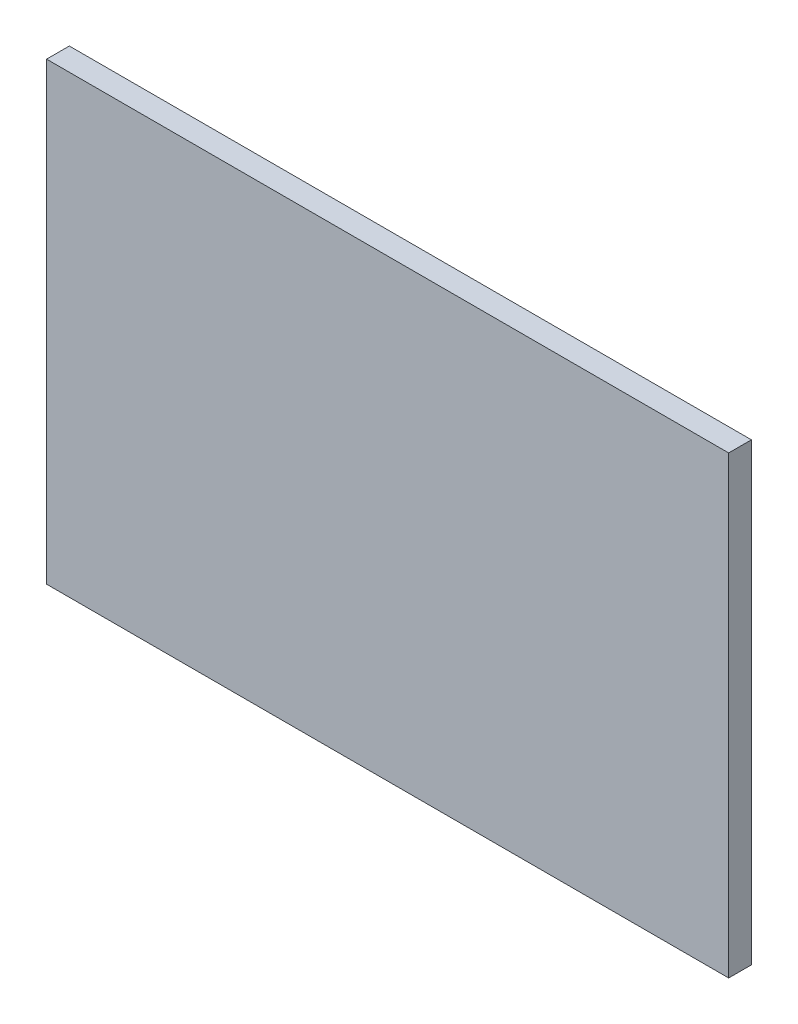
ISO-10303-21;
HEADER;
FILE_DESCRIPTION(('STEP AP214'),'2;1');
FILE_NAME('part.step','',(''),(''),'','','');
FILE_SCHEMA(('AUTOMOTIVE_DESIGN { 1 0 10303 214 1 1 1 1 }'));
ENDSEC;
DATA;
#1=APPLICATION_CONTEXT('core data for automotive mechanical design processes');
#2=APPLICATION_PROTOCOL_DEFINITION('international standard','automotive_design',2000,#1);
#3=PRODUCT_CONTEXT('',#1,'mechanical');
#4=PRODUCT('Part','Part','',(#3));
#5=PRODUCT_RELATED_PRODUCT_CATEGORY('part','',(#4));
#6=PRODUCT_DEFINITION_FORMATION('','',#4);
#7=PRODUCT_DEFINITION_CONTEXT('part definition',#1,'design');
#8=PRODUCT_DEFINITION('design','',#6,#7);
#9=PRODUCT_DEFINITION_SHAPE('','',#8);
#10=(LENGTH_UNIT() NAMED_UNIT(*) SI_UNIT(.MILLI.,.METRE.));
#11=(NAMED_UNIT(*) PLANE_ANGLE_UNIT() SI_UNIT($,.RADIAN.));
#12=(NAMED_UNIT(*) SI_UNIT($,.STERADIAN.) SOLID_ANGLE_UNIT());
#13=UNCERTAINTY_MEASURE_WITH_UNIT(LENGTH_MEASURE(1.E-05),#10,'distance_accuracy_value','');
#14=(GEOMETRIC_REPRESENTATION_CONTEXT(3) GLOBAL_UNCERTAINTY_ASSIGNED_CONTEXT((#13)) GLOBAL_UNIT_ASSIGNED_CONTEXT((#10,
#11,#12)) REPRESENTATION_CONTEXT('',''));
#15=CARTESIAN_POINT('',(0.,0.,0.));
#16=DIRECTION('',(0.,0.,1.));
#17=DIRECTION('',(1.,0.,0.));
#18=AXIS2_PLACEMENT_3D('',#15,#16,#17);
#19=CARTESIAN_POINT('',(0.,0.,-3.));
#20=DIRECTION('',(-1.,0.,0.));
#21=DIRECTION('',(0.,0.,1.));
#22=AXIS2_PLACEMENT_3D('',#19,#20,#21);
#23=PLANE('',#22);
#24=DIRECTION('',(0.,-1.,0.));
#25=VECTOR('',#24,1.);
#26=CARTESIAN_POINT('',(0.,0.,0.));
#27=LINE('',#26,#25);
#28=CARTESIAN_POINT('',(0.,60.,0.));
#29=VERTEX_POINT('',#28);
#30=CARTESIAN_POINT('',(0.,0.,0.));
#31=VERTEX_POINT('',#30);
#32=EDGE_CURVE('E103',#29,#31,#27,.T.);
#33=ORIENTED_EDGE('',*,*,#32,.F.);
#34=DIRECTION('',(0.,0.,1.));
#35=VECTOR('',#34,1.);
#36=CARTESIAN_POINT('',(0.,60.,-3.));
#37=LINE('',#36,#35);
#38=CARTESIAN_POINT('',(0.,60.,-3.));
#39=VERTEX_POINT('',#38);
#40=EDGE_CURVE('E11',#39,#29,#37,.T.);
#41=ORIENTED_EDGE('',*,*,#40,.F.);
#42=DIRECTION('',(0.,-1.,0.));
#43=VECTOR('',#42,1.);
#44=CARTESIAN_POINT('',(0.,0.,-3.));
#45=LINE('',#44,#43);
#46=CARTESIAN_POINT('',(0.,0.,-3.));
#47=VERTEX_POINT('',#46);
#48=EDGE_CURVE('E97',#39,#47,#45,.T.);
#49=ORIENTED_EDGE('',*,*,#48,.T.);
#50=DIRECTION('',(0.,0.,1.));
#51=VECTOR('',#50,1.);
#52=CARTESIAN_POINT('',(0.,0.,-3.));
#53=LINE('',#52,#51);
#54=EDGE_CURVE('E42',#47,#31,#53,.T.);
#55=ORIENTED_EDGE('',*,*,#54,.T.);
#56=EDGE_LOOP('',(#33,#41,#49,#55));
#57=FACE_BOUND('',#56,.T.);
#58=ADVANCED_FACE('F39',(#57),#23,.T.);
#59=CARTESIAN_POINT('',(0.,60.,-3.));
#60=DIRECTION('',(0.,1.,0.));
#61=DIRECTION('',(0.,0.,1.));
#62=AXIS2_PLACEMENT_3D('',#59,#60,#61);
#63=PLANE('',#62);
#64=DIRECTION('',(-1.,0.,0.));
#65=VECTOR('',#64,1.);
#66=CARTESIAN_POINT('',(0.,60.,0.));
#67=LINE('',#66,#65);
#68=CARTESIAN_POINT('',(90.,60.,0.));
#69=VERTEX_POINT('',#68);
#70=EDGE_CURVE('E99',#69,#29,#67,.T.);
#71=ORIENTED_EDGE('',*,*,#70,.F.);
#72=DIRECTION('',(0.,0.,1.));
#73=VECTOR('',#72,1.);
#74=CARTESIAN_POINT('',(90.,60.,-3.));
#75=LINE('',#74,#73);
#76=CARTESIAN_POINT('',(90.,60.,-3.));
#77=VERTEX_POINT('',#76);
#78=EDGE_CURVE('E48',#77,#69,#75,.T.);
#79=ORIENTED_EDGE('',*,*,#78,.F.);
#80=DIRECTION('',(-1.,0.,0.));
#81=VECTOR('',#80,1.);
#82=CARTESIAN_POINT('',(0.,60.,-3.));
#83=LINE('',#82,#81);
#84=EDGE_CURVE('E94',#77,#39,#83,.T.);
#85=ORIENTED_EDGE('',*,*,#84,.T.);
#86=ORIENTED_EDGE('',*,*,#40,.T.);
#87=EDGE_LOOP('',(#71,#79,#85,#86));
#88=FACE_BOUND('',#87,.T.);
#89=ADVANCED_FACE('F113',(#88),#63,.T.);
#90=CARTESIAN_POINT('',(90.,0.,-3.));
#91=DIRECTION('',(1.,0.,0.));
#92=DIRECTION('',(0.,0.,-1.));
#93=AXIS2_PLACEMENT_3D('',#90,#91,#92);
#94=PLANE('',#93);
#95=DIRECTION('',(0.,1.,0.));
#96=VECTOR('',#95,1.);
#97=CARTESIAN_POINT('',(90.,0.,0.));
#98=LINE('',#97,#96);
#99=CARTESIAN_POINT('',(90.,0.,0.));
#100=VERTEX_POINT('',#99);
#101=EDGE_CURVE('E89',#100,#69,#98,.T.);
#102=ORIENTED_EDGE('',*,*,#101,.F.);
#103=DIRECTION('',(0.,0.,1.));
#104=VECTOR('',#103,1.);
#105=CARTESIAN_POINT('',(90.,0.,-3.));
#106=LINE('',#105,#104);
#107=CARTESIAN_POINT('',(90.,0.,-3.));
#108=VERTEX_POINT('',#107);
#109=EDGE_CURVE('E84',#108,#100,#106,.T.);
#110=ORIENTED_EDGE('',*,*,#109,.F.);
#111=DIRECTION('',(0.,1.,0.));
#112=VECTOR('',#111,1.);
#113=CARTESIAN_POINT('',(90.,0.,-3.));
#114=LINE('',#113,#112);
#115=EDGE_CURVE('E87',#108,#77,#114,.T.);
#116=ORIENTED_EDGE('',*,*,#115,.T.);
#117=ORIENTED_EDGE('',*,*,#78,.T.);
#118=EDGE_LOOP('',(#102,#110,#116,#117));
#119=FACE_BOUND('',#118,.T.);
#120=ADVANCED_FACE('F86',(#119),#94,.T.);
#121=CARTESIAN_POINT('',(0.,0.,-3.));
#122=DIRECTION('',(0.,-1.,0.));
#123=DIRECTION('',(0.,0.,-1.));
#124=AXIS2_PLACEMENT_3D('',#121,#122,#123);
#125=PLANE('',#124);
#126=DIRECTION('',(1.,0.,0.));
#127=VECTOR('',#126,1.);
#128=CARTESIAN_POINT('',(0.,0.,0.));
#129=LINE('',#128,#127);
#130=EDGE_CURVE('E106',#31,#100,#129,.T.);
#131=ORIENTED_EDGE('',*,*,#130,.F.);
#132=ORIENTED_EDGE('',*,*,#54,.F.);
#133=DIRECTION('',(1.,0.,0.));
#134=VECTOR('',#133,1.);
#135=CARTESIAN_POINT('',(0.,0.,-3.));
#136=LINE('',#135,#134);
#137=EDGE_CURVE('E93',#47,#108,#136,.T.);
#138=ORIENTED_EDGE('',*,*,#137,.T.);
#139=ORIENTED_EDGE('',*,*,#109,.T.);
#140=EDGE_LOOP('',(#131,#132,#138,#139));
#141=FACE_BOUND('',#140,.T.);
#142=ADVANCED_FACE('F96',(#141),#125,.T.);
#143=CARTESIAN_POINT('',(0.,0.,-3.));
#144=DIRECTION('',(0.,0.,-1.));
#145=DIRECTION('',(-1.,0.,0.));
#146=AXIS2_PLACEMENT_3D('',#143,#144,#145);
#147=PLANE('',#146);
#148=ORIENTED_EDGE('',*,*,#48,.F.);
#149=ORIENTED_EDGE('',*,*,#84,.F.);
#150=ORIENTED_EDGE('',*,*,#115,.F.);
#151=ORIENTED_EDGE('',*,*,#137,.F.);
#152=EDGE_LOOP('',(#148,#149,#150,#151));
#153=FACE_BOUND('',#152,.T.);
#154=ADVANCED_FACE('F92',(#153),#147,.T.);
#155=CARTESIAN_POINT('',(0.,0.,0.));
#156=DIRECTION('',(0.,0.,-1.));
#157=DIRECTION('',(-1.,0.,0.));
#158=AXIS2_PLACEMENT_3D('',#155,#156,#157);
#159=PLANE('',#158);
#160=ORIENTED_EDGE('',*,*,#32,.T.);
#161=ORIENTED_EDGE('',*,*,#130,.T.);
#162=ORIENTED_EDGE('',*,*,#101,.T.);
#163=ORIENTED_EDGE('',*,*,#70,.T.);
#164=EDGE_LOOP('',(#160,#161,#162,#163));
#165=FACE_BOUND('',#164,.T.);
#166=ADVANCED_FACE('F112',(#165),#159,.F.);
#167=CLOSED_SHELL('',(#58,#89,#120,#142,#154,#166));
#168=MANIFOLD_SOLID_BREP('B2',#167);
#169=ADVANCED_BREP_SHAPE_REPRESENTATION('',(#18,#168),#14);
#170=SHAPE_DEFINITION_REPRESENTATION(#9,#169);
ENDSEC;
END-ISO-10303-21;
